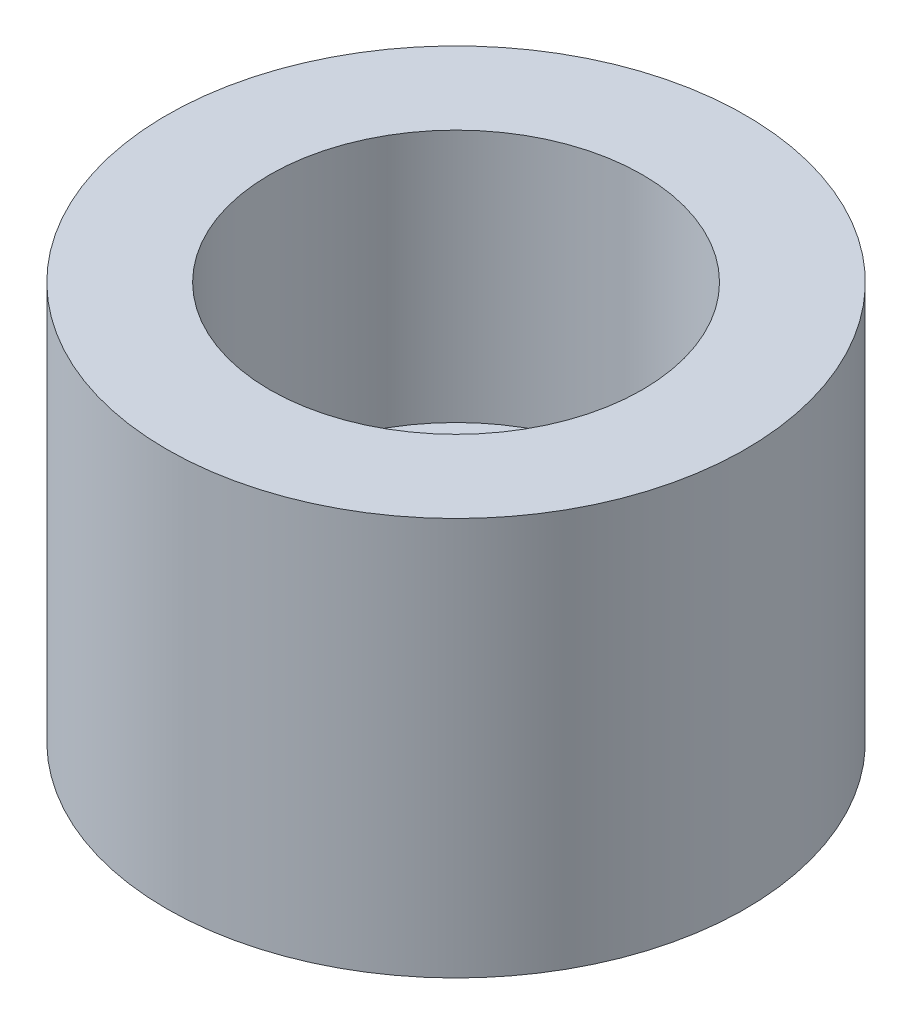
ISO-10303-21;
HEADER;
FILE_DESCRIPTION(('STEP AP214'),'2;1');
FILE_NAME('part.step','',(''),(''),'','','');
FILE_SCHEMA(('AUTOMOTIVE_DESIGN { 1 0 10303 214 1 1 1 1 }'));
ENDSEC;
DATA;
#1=APPLICATION_CONTEXT('core data for automotive mechanical design processes');
#2=APPLICATION_PROTOCOL_DEFINITION('international standard','automotive_design',2000,#1);
#3=PRODUCT_CONTEXT('',#1,'mechanical');
#4=PRODUCT('Part','Part','',(#3));
#5=PRODUCT_RELATED_PRODUCT_CATEGORY('part','',(#4));
#6=PRODUCT_DEFINITION_FORMATION('','',#4);
#7=PRODUCT_DEFINITION_CONTEXT('part definition',#1,'design');
#8=PRODUCT_DEFINITION('design','',#6,#7);
#9=PRODUCT_DEFINITION_SHAPE('','',#8);
#10=(LENGTH_UNIT() NAMED_UNIT(*) SI_UNIT(.MILLI.,.METRE.));
#11=(NAMED_UNIT(*) PLANE_ANGLE_UNIT() SI_UNIT($,.RADIAN.));
#12=(NAMED_UNIT(*) SI_UNIT($,.STERADIAN.) SOLID_ANGLE_UNIT());
#13=UNCERTAINTY_MEASURE_WITH_UNIT(LENGTH_MEASURE(1.E-05),#10,'distance_accuracy_value','');
#14=(GEOMETRIC_REPRESENTATION_CONTEXT(3) GLOBAL_UNCERTAINTY_ASSIGNED_CONTEXT((#13)) GLOBAL_UNIT_ASSIGNED_CONTEXT((#10,
#11,#12)) REPRESENTATION_CONTEXT('',''));
#15=CARTESIAN_POINT('',(0.,0.,0.));
#16=DIRECTION('',(0.,0.,1.));
#17=DIRECTION('',(1.,0.,0.));
#18=AXIS2_PLACEMENT_3D('',#15,#16,#17);
#19=CARTESIAN_POINT('',(0.,4.,0.));
#20=DIRECTION('',(0.,1.,0.));
#21=DIRECTION('',(0.,0.,1.));
#22=AXIS2_PLACEMENT_3D('',#19,#20,#21);
#23=PLANE('',#22);
#24=CARTESIAN_POINT('',(0.,4.,0.));
#25=DIRECTION('',(0.,1.,0.));
#26=DIRECTION('',(0.,0.,1.));
#27=AXIS2_PLACEMENT_3D('',#24,#25,#26);
#28=CIRCLE('',#27,1.65);
#29=CARTESIAN_POINT('',(0.,4.,1.65));
#30=VERTEX_POINT('',#29);
#31=EDGE_CURVE('E47',#30,#30,#28,.T.);
#32=ORIENTED_EDGE('',*,*,#31,.F.);
#33=EDGE_LOOP('',(#32));
#34=FACE_BOUND('',#33,.T.);
#35=CARTESIAN_POINT('',(0.,4.,0.));
#36=DIRECTION('',(0.,1.,0.));
#37=DIRECTION('',(0.,0.,1.));
#38=AXIS2_PLACEMENT_3D('',#35,#36,#37);
#39=CIRCLE('',#38,5.15);
#40=CARTESIAN_POINT('',(0.,4.,5.15));
#41=VERTEX_POINT('',#40);
#42=EDGE_CURVE('E64',#41,#41,#39,.T.);
#43=ORIENTED_EDGE('',*,*,#42,.T.);
#44=EDGE_LOOP('',(#43));
#45=FACE_BOUND('',#44,.T.);
#46=ADVANCED_FACE('F39',(#34,#45),#23,.T.);
#47=CARTESIAN_POINT('',(0.,0.,0.));
#48=DIRECTION('',(0.,1.,0.));
#49=DIRECTION('',(0.,0.,1.));
#50=AXIS2_PLACEMENT_3D('',#47,#48,#49);
#51=PLANE('',#50);
#52=CARTESIAN_POINT('',(0.,0.,0.));
#53=DIRECTION('',(0.,1.,0.));
#54=DIRECTION('',(0.,0.,1.));
#55=AXIS2_PLACEMENT_3D('',#52,#53,#54);
#56=CIRCLE('',#55,8.);
#57=CARTESIAN_POINT('',(0.,0.,8.));
#58=VERTEX_POINT('',#57);
#59=EDGE_CURVE('E10',#58,#58,#56,.T.);
#60=ORIENTED_EDGE('',*,*,#59,.F.);
#61=EDGE_LOOP('',(#60));
#62=FACE_BOUND('',#61,.T.);
#63=CARTESIAN_POINT('',(0.,0.,0.));
#64=DIRECTION('',(0.,1.,0.));
#65=DIRECTION('',(0.,0.,1.));
#66=AXIS2_PLACEMENT_3D('',#63,#64,#65);
#67=CIRCLE('',#66,1.65);
#68=CARTESIAN_POINT('',(0.,0.,1.65));
#69=VERTEX_POINT('',#68);
#70=EDGE_CURVE('E52',#69,#69,#67,.T.);
#71=ORIENTED_EDGE('',*,*,#70,.T.);
#72=EDGE_LOOP('',(#71));
#73=FACE_BOUND('',#72,.T.);
#74=ADVANCED_FACE('F87',(#62,#73),#51,.F.);
#75=CARTESIAN_POINT('',(0.,4.,0.));
#76=DIRECTION('',(0.,-1.,0.));
#77=DIRECTION('',(0.,0.,-1.));
#78=AXIS2_PLACEMENT_3D('',#75,#76,#77);
#79=CYLINDRICAL_SURFACE('',#78,8.);
#80=ORIENTED_EDGE('',*,*,#59,.T.);
#81=EDGE_LOOP('',(#80));
#82=FACE_BOUND('',#81,.T.);
#83=CARTESIAN_POINT('',(0.,11.,0.));
#84=DIRECTION('',(0.,1.,0.));
#85=DIRECTION('',(0.,0.,1.));
#86=AXIS2_PLACEMENT_3D('',#83,#84,#85);
#87=CIRCLE('',#86,8.);
#88=CARTESIAN_POINT('',(0.,11.,8.));
#89=VERTEX_POINT('',#88);
#90=EDGE_CURVE('E58',#89,#89,#87,.T.);
#91=ORIENTED_EDGE('',*,*,#90,.F.);
#92=EDGE_LOOP('',(#91));
#93=FACE_BOUND('',#92,.T.);
#94=ADVANCED_FACE('F41',(#82,#93),#79,.T.);
#95=CARTESIAN_POINT('',(0.,4.,0.));
#96=DIRECTION('',(0.,-1.,0.));
#97=DIRECTION('',(0.,0.,-1.));
#98=AXIS2_PLACEMENT_3D('',#95,#96,#97);
#99=CYLINDRICAL_SURFACE('',#98,1.65);
#100=ORIENTED_EDGE('',*,*,#31,.T.);
#101=EDGE_LOOP('',(#100));
#102=FACE_BOUND('',#101,.T.);
#103=ORIENTED_EDGE('',*,*,#70,.F.);
#104=EDGE_LOOP('',(#103));
#105=FACE_BOUND('',#104,.T.);
#106=ADVANCED_FACE('F77',(#102,#105),#99,.F.);
#107=CARTESIAN_POINT('',(0.,11.,0.));
#108=DIRECTION('',(0.,1.,0.));
#109=DIRECTION('',(0.,0.,1.));
#110=AXIS2_PLACEMENT_3D('',#107,#108,#109);
#111=PLANE('',#110);
#112=ORIENTED_EDGE('',*,*,#90,.T.);
#113=EDGE_LOOP('',(#112));
#114=FACE_BOUND('',#113,.T.);
#115=CARTESIAN_POINT('',(0.,11.,0.));
#116=DIRECTION('',(0.,1.,0.));
#117=DIRECTION('',(0.,0.,1.));
#118=AXIS2_PLACEMENT_3D('',#115,#116,#117);
#119=CIRCLE('',#118,5.15);
#120=CARTESIAN_POINT('',(0.,11.,5.15));
#121=VERTEX_POINT('',#120);
#122=EDGE_CURVE('E63',#121,#121,#119,.T.);
#123=ORIENTED_EDGE('',*,*,#122,.F.);
#124=EDGE_LOOP('',(#123));
#125=FACE_BOUND('',#124,.T.);
#126=ADVANCED_FACE('F75',(#114,#125),#111,.T.);
#127=CARTESIAN_POINT('',(0.,11.,0.));
#128=DIRECTION('',(0.,-1.,0.));
#129=DIRECTION('',(0.,0.,-1.));
#130=AXIS2_PLACEMENT_3D('',#127,#128,#129);
#131=CYLINDRICAL_SURFACE('',#130,5.15);
#132=ORIENTED_EDGE('',*,*,#122,.T.);
#133=EDGE_LOOP('',(#132));
#134=FACE_BOUND('',#133,.T.);
#135=ORIENTED_EDGE('',*,*,#42,.F.);
#136=EDGE_LOOP('',(#135));
#137=FACE_BOUND('',#136,.T.);
#138=ADVANCED_FACE('F72',(#134,#137),#131,.F.);
#139=CLOSED_SHELL('',(#46,#74,#94,#106,#126,#138));
#140=MANIFOLD_SOLID_BREP('B2',#139);
#141=ADVANCED_BREP_SHAPE_REPRESENTATION('',(#18,#140),#14);
#142=SHAPE_DEFINITION_REPRESENTATION(#9,#141);
ENDSEC;
END-ISO-10303-21;
